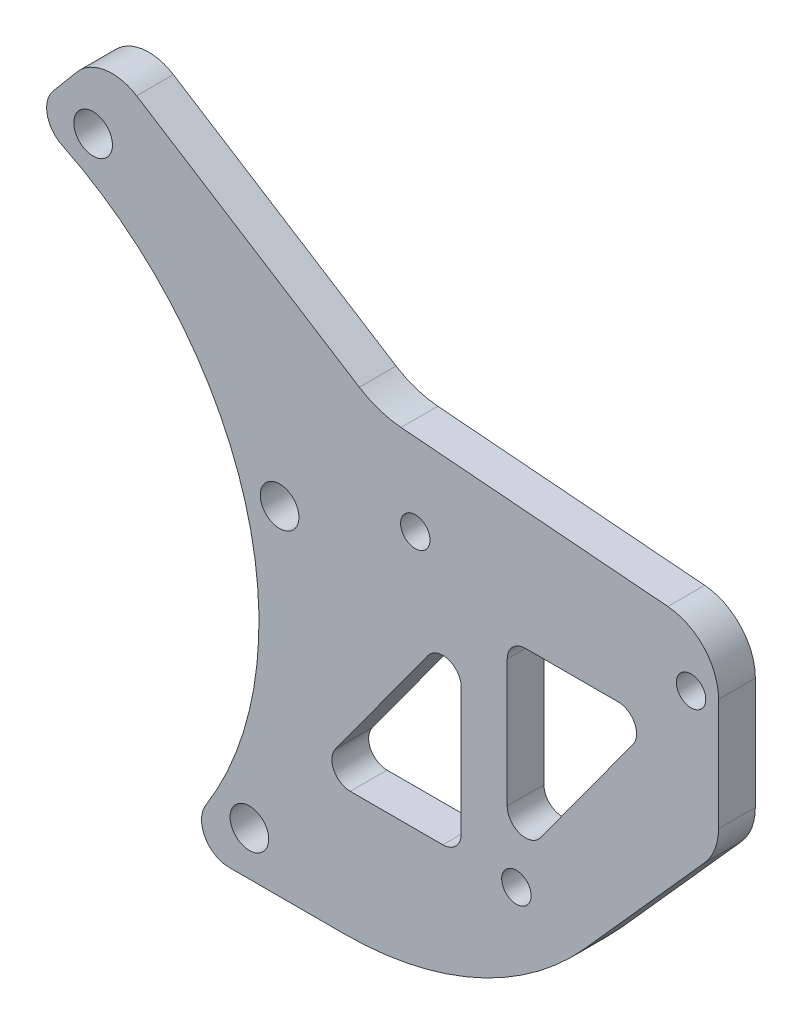
ISO-10303-21;
HEADER;
FILE_DESCRIPTION(('STEP AP214'),'2;1');
FILE_NAME('part.step','',(''),(''),'','','');
FILE_SCHEMA(('AUTOMOTIVE_DESIGN { 1 0 10303 214 1 1 1 1 }'));
ENDSEC;
DATA;
#1=APPLICATION_CONTEXT('core data for automotive mechanical design processes');
#2=APPLICATION_PROTOCOL_DEFINITION('international standard','automotive_design',2000,#1);
#3=PRODUCT_CONTEXT('',#1,'mechanical');
#4=PRODUCT('Part','Part','',(#3));
#5=PRODUCT_RELATED_PRODUCT_CATEGORY('part','',(#4));
#6=PRODUCT_DEFINITION_FORMATION('','',#4);
#7=PRODUCT_DEFINITION_CONTEXT('part definition',#1,'design');
#8=PRODUCT_DEFINITION('design','',#6,#7);
#9=PRODUCT_DEFINITION_SHAPE('','',#8);
#10=(LENGTH_UNIT() NAMED_UNIT(*) SI_UNIT(.MILLI.,.METRE.));
#11=(NAMED_UNIT(*) PLANE_ANGLE_UNIT() SI_UNIT($,.RADIAN.));
#12=(NAMED_UNIT(*) SI_UNIT($,.STERADIAN.) SOLID_ANGLE_UNIT());
#13=UNCERTAINTY_MEASURE_WITH_UNIT(LENGTH_MEASURE(1.E-05),#10,'distance_accuracy_value','');
#14=(GEOMETRIC_REPRESENTATION_CONTEXT(3) GLOBAL_UNCERTAINTY_ASSIGNED_CONTEXT((#13)) GLOBAL_UNIT_ASSIGNED_CONTEXT((#10,
#11,#12)) REPRESENTATION_CONTEXT('',''));
#15=CARTESIAN_POINT('',(0.,0.,0.));
#16=DIRECTION('',(0.,0.,1.));
#17=DIRECTION('',(1.,0.,0.));
#18=AXIS2_PLACEMENT_3D('',#15,#16,#17);
#19=CARTESIAN_POINT('',(0.,0.,4.));
#20=DIRECTION('',(0.,0.,-1.));
#21=DIRECTION('',(-1.,0.,0.));
#22=AXIS2_PLACEMENT_3D('',#19,#20,#21);
#23=CYLINDRICAL_SURFACE('',#22,38.);
#24=CARTESIAN_POINT('',(0.,0.,0.));
#25=DIRECTION('',(0.,0.,1.));
#26=DIRECTION('',(1.,0.,0.));
#27=AXIS2_PLACEMENT_3D('',#24,#25,#26);
#28=CIRCLE('',#27,38.);
#29=CARTESIAN_POINT('',(32.2078784178792,-20.1656283765003,0.));
#30=VERTEX_POINT('',#29);
#31=CARTESIAN_POINT('',(16.5911175233825,34.1867638030468,0.));
#32=VERTEX_POINT('',#31);
#33=EDGE_CURVE('E376',#30,#32,#28,.T.);
#34=ORIENTED_EDGE('',*,*,#33,.F.);
#35=DIRECTION('',(0.,0.,-1.));
#36=VECTOR('',#35,1.);
#37=CARTESIAN_POINT('',(32.2078784178792,-20.1656283765003,4.));
#38=LINE('',#37,#36);
#39=CARTESIAN_POINT('',(32.2078784178792,-20.1656283765003,4.));
#40=VERTEX_POINT('',#39);
#41=EDGE_CURVE('E354',#30,#40,#38,.F.);
#42=ORIENTED_EDGE('',*,*,#41,.T.);
#43=CARTESIAN_POINT('',(0.,0.,4.));
#44=DIRECTION('',(0.,0.,1.));
#45=DIRECTION('',(1.,0.,0.));
#46=AXIS2_PLACEMENT_3D('',#43,#44,#45);
#47=CIRCLE('',#46,38.);
#48=CARTESIAN_POINT('',(16.5911175233825,34.1867638030468,4.));
#49=VERTEX_POINT('',#48);
#50=EDGE_CURVE('E364',#40,#49,#47,.T.);
#51=ORIENTED_EDGE('',*,*,#50,.T.);
#52=DIRECTION('',(0.,0.,-1.));
#53=VECTOR('',#52,1.);
#54=CARTESIAN_POINT('',(16.5911175233825,34.1867638030468,4.));
#55=LINE('',#54,#53);
#56=EDGE_CURVE('E351',#49,#32,#55,.T.);
#57=ORIENTED_EDGE('',*,*,#56,.T.);
#58=EDGE_LOOP('',(#34,#42,#51,#57));
#59=FACE_BOUND('',#58,.T.);
#60=ADVANCED_FACE('F41',(#59),#23,.F.);
#61=CARTESIAN_POINT('',(0.,-24.7576516693819,4.));
#62=DIRECTION('',(0.,-1.,0.));
#63=DIRECTION('',(0.,0.,-1.));
#64=AXIS2_PLACEMENT_3D('',#61,#62,#63);
#65=PLANE('',#64);
#66=DIRECTION('',(-1.,0.,0.));
#67=VECTOR('',#66,1.);
#68=CARTESIAN_POINT('',(0.,-24.7576516693819,4.));
#69=LINE('',#68,#67);
#70=CARTESIAN_POINT('',(47.3259544985668,-24.7576516693819,4.));
#71=VERTEX_POINT('',#70);
#72=CARTESIAN_POINT('',(34.750605661396,-24.7576516693819,4.));
#73=VERTEX_POINT('',#72);
#74=EDGE_CURVE('E362',#71,#73,#69,.T.);
#75=ORIENTED_EDGE('',*,*,#74,.T.);
#76=DIRECTION('',(0.,0.,-1.));
#77=VECTOR('',#76,1.);
#78=CARTESIAN_POINT('',(34.750605661396,-24.7576516693819,4.));
#79=LINE('',#78,#77);
#80=CARTESIAN_POINT('',(34.750605661396,-24.7576516693819,0.));
#81=VERTEX_POINT('',#80);
#82=EDGE_CURVE('E345',#73,#81,#79,.T.);
#83=ORIENTED_EDGE('',*,*,#82,.T.);
#84=DIRECTION('',(-1.,0.,0.));
#85=VECTOR('',#84,1.);
#86=CARTESIAN_POINT('',(0.,-24.7576516693819,0.));
#87=LINE('',#86,#85);
#88=CARTESIAN_POINT('',(47.3259544985668,-24.7576516693819,0.));
#89=VERTEX_POINT('',#88);
#90=EDGE_CURVE('E377',#89,#81,#87,.T.);
#91=ORIENTED_EDGE('',*,*,#90,.F.);
#92=DIRECTION('',(0.,0.,-1.));
#93=VECTOR('',#92,1.);
#94=CARTESIAN_POINT('',(47.3259544985668,-24.7576516693819,4.));
#95=LINE('',#94,#93);
#96=EDGE_CURVE('E283',#89,#71,#95,.F.);
#97=ORIENTED_EDGE('',*,*,#96,.T.);
#98=EDGE_LOOP('',(#75,#83,#91,#97));
#99=FACE_BOUND('',#98,.T.);
#100=ADVANCED_FACE('F369',(#99),#65,.T.);
#101=CARTESIAN_POINT('',(47.3526048818493,-42.2791115016511,4.));
#102=DIRECTION('',(0.745937661625915,-0.666015769308852,0.));
#103=DIRECTION('',(0.666015769308852,0.745937661625915,0.));
#104=AXIS2_PLACEMENT_3D('',#101,#102,#103);
#105=PLANE('',#104);
#106=DIRECTION('',(-0.666015769308852,-0.745937661625915,0.));
#107=VECTOR('',#106,1.);
#108=CARTESIAN_POINT('',(47.3526048818493,-42.2791115016511,4.));
#109=LINE('',#108,#107);
#110=CARTESIAN_POINT('',(86.4723914161309,1.53504941674431,4.));
#111=VERTEX_POINT('',#110);
#112=CARTESIAN_POINT('',(73.4337726554738,-13.0682035951917,4.));
#113=VERTEX_POINT('',#112);
#114=EDGE_CURVE('E372',#111,#113,#109,.T.);
#115=ORIENTED_EDGE('',*,*,#114,.T.);
#116=DIRECTION('',(0.,0.,-1.));
#117=VECTOR('',#116,1.);
#118=CARTESIAN_POINT('',(73.4337726554738,-13.0682035951917,4.));
#119=LINE('',#118,#117);
#120=CARTESIAN_POINT('',(73.4337726554738,-13.0682035951917,0.));
#121=VERTEX_POINT('',#120);
#122=EDGE_CURVE('E278',#113,#121,#119,.T.);
#123=ORIENTED_EDGE('',*,*,#122,.T.);
#124=DIRECTION('',(-0.666015769308852,-0.745937661625915,0.));
#125=VECTOR('',#124,1.);
#126=CARTESIAN_POINT('',(47.3526048818493,-42.2791115016511,0.));
#127=LINE('',#126,#125);
#128=CARTESIAN_POINT('',(86.4723914161309,1.53504941674431,0.));
#129=VERTEX_POINT('',#128);
#130=EDGE_CURVE('E382',#129,#121,#127,.T.);
#131=ORIENTED_EDGE('',*,*,#130,.F.);
#132=DIRECTION('',(0.,0.,-1.));
#133=VECTOR('',#132,1.);
#134=CARTESIAN_POINT('',(86.4723914161309,1.53504941674431,4.));
#135=LINE('',#134,#133);
#136=EDGE_CURVE('E259',#129,#111,#135,.F.);
#137=ORIENTED_EDGE('',*,*,#136,.T.);
#138=EDGE_LOOP('',(#115,#123,#131,#137));
#139=FACE_BOUND('',#138,.T.);
#140=ADVANCED_FACE('F452',(#139),#105,.T.);
#141=CARTESIAN_POINT('',(87.9967654463754,0.,4.));
#142=DIRECTION('',(1.,0.,0.));
#143=DIRECTION('',(0.,0.,-1.));
#144=AXIS2_PLACEMENT_3D('',#141,#142,#143);
#145=PLANE('',#144);
#146=DIRECTION('',(0.,-1.,0.));
#147=VECTOR('',#146,1.);
#148=CARTESIAN_POINT('',(87.9967654463754,0.,4.));
#149=LINE('',#148,#147);
#150=CARTESIAN_POINT('',(87.9967654463754,17.7091447003682,4.));
#151=VERTEX_POINT('',#150);
#152=CARTESIAN_POINT('',(87.9967654463754,5.53114403259741,4.));
#153=VERTEX_POINT('',#152);
#154=EDGE_CURVE('E410',#151,#153,#149,.T.);
#155=ORIENTED_EDGE('',*,*,#154,.T.);
#156=DIRECTION('',(0.,0.,-1.));
#157=VECTOR('',#156,1.);
#158=CARTESIAN_POINT('',(87.9967654463754,5.53114403259741,4.));
#159=LINE('',#158,#157);
#160=CARTESIAN_POINT('',(87.9967654463754,5.53114403259741,0.));
#161=VERTEX_POINT('',#160);
#162=EDGE_CURVE('E252',#153,#161,#159,.T.);
#163=ORIENTED_EDGE('',*,*,#162,.T.);
#164=DIRECTION('',(0.,-1.,0.));
#165=VECTOR('',#164,1.);
#166=CARTESIAN_POINT('',(87.9967654463754,0.,0.));
#167=LINE('',#166,#165);
#168=CARTESIAN_POINT('',(87.9967654463754,17.7091447003682,0.));
#169=VERTEX_POINT('',#168);
#170=EDGE_CURVE('E391',#169,#161,#167,.T.);
#171=ORIENTED_EDGE('',*,*,#170,.F.);
#172=DIRECTION('',(0.,0.,-1.));
#173=VECTOR('',#172,1.);
#174=CARTESIAN_POINT('',(87.9967654463754,17.7091447003682,4.));
#175=LINE('',#174,#173);
#176=EDGE_CURVE('E250',#169,#151,#175,.F.);
#177=ORIENTED_EDGE('',*,*,#176,.T.);
#178=EDGE_LOOP('',(#155,#163,#171,#177));
#179=FACE_BOUND('',#178,.T.);
#180=ADVANCED_FACE('F672',(#179),#145,.T.);
#181=CARTESIAN_POINT('',(2.44693146133236,30.1788213564325,4.));
#182=DIRECTION('',(0.0808158687660548,0.996729048114676,0.));
#183=DIRECTION('',(-0.996729048114676,0.0808158687660548,0.));
#184=AXIS2_PLACEMENT_3D('',#181,#182,#183);
#185=PLANE('',#184);
#186=DIRECTION('',(0.996729048114676,-0.0808158687660548,0.));
#187=VECTOR('',#186,1.);
#188=CARTESIAN_POINT('',(2.44693146133236,30.1788213564325,0.));
#189=LINE('',#188,#187);
#190=CARTESIAN_POINT('',(53.4552970579246,26.0430079296817,0.));
#191=VERTEX_POINT('',#190);
#192=CARTESIAN_POINT('',(82.4816606589718,23.6895189890563,0.));
#193=VERTEX_POINT('',#192);
#194=EDGE_CURVE('E394',#191,#193,#189,.T.);
#195=ORIENTED_EDGE('',*,*,#194,.F.);
#196=DIRECTION('',(0.,0.,-1.));
#197=VECTOR('',#196,1.);
#198=CARTESIAN_POINT('',(53.4552970579246,26.0430079296817,4.));
#199=LINE('',#198,#197);
#200=CARTESIAN_POINT('',(53.4552970579246,26.0430079296817,4.));
#201=VERTEX_POINT('',#200);
#202=EDGE_CURVE('E272',#191,#201,#199,.F.);
#203=ORIENTED_EDGE('',*,*,#202,.T.);
#204=DIRECTION('',(0.996729048114676,-0.0808158687660548,0.));
#205=VECTOR('',#204,1.);
#206=CARTESIAN_POINT('',(2.44693146133236,30.1788213564325,4.));
#207=LINE('',#206,#205);
#208=CARTESIAN_POINT('',(82.4816606589718,23.6895189890563,4.));
#209=VERTEX_POINT('',#208);
#210=EDGE_CURVE('E413',#201,#209,#207,.T.);
#211=ORIENTED_EDGE('',*,*,#210,.T.);
#212=DIRECTION('',(0.,0.,-1.));
#213=VECTOR('',#212,1.);
#214=CARTESIAN_POINT('',(82.4816606589718,23.6895189890563,4.));
#215=LINE('',#214,#213);
#216=EDGE_CURVE('E266',#209,#193,#215,.T.);
#217=ORIENTED_EDGE('',*,*,#216,.T.);
#218=EDGE_LOOP('',(#195,#203,#211,#217));
#219=FACE_BOUND('',#218,.T.);
#220=ADVANCED_FACE('F664',(#219),#185,.T.);
#221=CARTESIAN_POINT('',(26.4615153644678,41.7813400491597,4.));
#222=DIRECTION('',(0.535052081184345,0.844819075554229,0.));
#223=DIRECTION('',(-0.844819075554229,0.535052081184345,0.));
#224=AXIS2_PLACEMENT_3D('',#221,#222,#223);
#225=PLANE('',#224);
#226=DIRECTION('',(0.844819075554229,-0.535052081184345,0.));
#227=VECTOR('',#226,1.);
#228=CARTESIAN_POINT('',(26.4615153644678,41.7813400491597,4.));
#229=LINE('',#228,#227);
#230=CARTESIAN_POINT('',(24.691260684177,42.9025013466772,4.));
#231=VERTEX_POINT('',#230);
#232=CARTESIAN_POINT('',(48.9129349337417,27.5621076552862,4.));
#233=VERTEX_POINT('',#232);
#234=EDGE_CURVE('E415',#231,#233,#229,.T.);
#235=ORIENTED_EDGE('',*,*,#234,.T.);
#236=DIRECTION('',(0.,0.,-1.));
#237=VECTOR('',#236,1.);
#238=CARTESIAN_POINT('',(48.9129349337417,27.5621076552862,0.));
#239=LINE('',#238,#237);
#240=CARTESIAN_POINT('',(48.9129349337417,27.5621076552862,0.));
#241=VERTEX_POINT('',#240);
#242=EDGE_CURVE('E269',#233,#241,#239,.T.);
#243=ORIENTED_EDGE('',*,*,#242,.T.);
#244=DIRECTION('',(0.844819075554229,-0.535052081184345,0.));
#245=VECTOR('',#244,1.);
#246=CARTESIAN_POINT('',(26.4615153644678,41.7813400491597,0.));
#247=LINE('',#246,#245);
#248=CARTESIAN_POINT('',(24.691260684177,42.9025013466772,0.));
#249=VERTEX_POINT('',#248);
#250=EDGE_CURVE('E225',#249,#241,#247,.T.);
#251=ORIENTED_EDGE('',*,*,#250,.F.);
#252=DIRECTION('',(0.,0.,-1.));
#253=VECTOR('',#252,1.);
#254=CARTESIAN_POINT('',(24.691260684177,42.9025013466772,4.));
#255=LINE('',#254,#253);
#256=EDGE_CURVE('E233',#249,#231,#255,.F.);
#257=ORIENTED_EDGE('',*,*,#256,.T.);
#258=EDGE_LOOP('',(#235,#243,#251,#257));
#259=FACE_BOUND('',#258,.T.);
#260=ADVANCED_FACE('F658',(#259),#225,.T.);
#261=CARTESIAN_POINT('',(40.243259995168,12.019984399379,4.));
#262=DIRECTION('',(0.,0.,-1.));
#263=DIRECTION('',(-1.,0.,0.));
#264=AXIS2_PLACEMENT_3D('',#261,#262,#263);
#265=CYLINDRICAL_SURFACE('',#264,2.1);
#266=CARTESIAN_POINT('',(40.243259995168,12.019984399379,4.));
#267=DIRECTION('',(0.,0.,1.));
#268=DIRECTION('',(1.,0.,0.));
#269=AXIS2_PLACEMENT_3D('',#266,#267,#268);
#270=CIRCLE('',#269,2.1);
#271=CARTESIAN_POINT('',(42.343259995168,12.019984399379,4.));
#272=VERTEX_POINT('',#271);
#273=EDGE_CURVE('E241',#272,#272,#270,.T.);
#274=ORIENTED_EDGE('',*,*,#273,.T.);
#275=EDGE_LOOP('',(#274));
#276=FACE_BOUND('',#275,.T.);
#277=CARTESIAN_POINT('',(40.243259995168,12.019984399379,0.));
#278=DIRECTION('',(0.,0.,1.));
#279=DIRECTION('',(1.,0.,0.));
#280=AXIS2_PLACEMENT_3D('',#277,#278,#279);
#281=CIRCLE('',#280,2.1);
#282=CARTESIAN_POINT('',(42.343259995168,12.019984399379,0.));
#283=VERTEX_POINT('',#282);
#284=EDGE_CURVE('E398',#283,#283,#281,.T.);
#285=ORIENTED_EDGE('',*,*,#284,.F.);
#286=EDGE_LOOP('',(#285));
#287=FACE_BOUND('',#286,.T.);
#288=ADVANCED_FACE('F424',(#276,#287),#265,.F.);
#289=CARTESIAN_POINT('',(36.9556945181939,-19.9568695610792,4.));
#290=DIRECTION('',(0.,0.,-1.));
#291=DIRECTION('',(-1.,0.,0.));
#292=AXIS2_PLACEMENT_3D('',#289,#290,#291);
#293=CYLINDRICAL_SURFACE('',#292,2.09999999999999);
#294=CARTESIAN_POINT('',(36.9556945181939,-19.9568695610792,4.));
#295=DIRECTION('',(0.,0.,1.));
#296=DIRECTION('',(1.,0.,0.));
#297=AXIS2_PLACEMENT_3D('',#294,#295,#296);
#298=CIRCLE('',#297,2.09999999999999);
#299=CARTESIAN_POINT('',(39.0556945181939,-19.9568695610792,4.));
#300=VERTEX_POINT('',#299);
#301=EDGE_CURVE('E419',#300,#300,#298,.T.);
#302=ORIENTED_EDGE('',*,*,#301,.T.);
#303=EDGE_LOOP('',(#302));
#304=FACE_BOUND('',#303,.T.);
#305=CARTESIAN_POINT('',(36.9556945181939,-19.9568695610792,0.));
#306=DIRECTION('',(0.,0.,1.));
#307=DIRECTION('',(1.,0.,0.));
#308=AXIS2_PLACEMENT_3D('',#305,#306,#307);
#309=CIRCLE('',#308,2.09999999999999);
#310=CARTESIAN_POINT('',(39.0556945181939,-19.9568695610792,0.));
#311=VERTEX_POINT('',#310);
#312=EDGE_CURVE('E224',#311,#311,#309,.T.);
#313=ORIENTED_EDGE('',*,*,#312,.F.);
#314=EDGE_LOOP('',(#313));
#315=FACE_BOUND('',#314,.T.);
#316=ADVANCED_FACE('F442',(#304,#315),#293,.F.);
#317=CARTESIAN_POINT('',(-9.95609994871663,8.35415979493229,4.));
#318=DIRECTION('',(-0.766044443118977,0.64278760968654,0.));
#319=DIRECTION('',(-0.64278760968654,-0.766044443118977,0.));
#320=AXIS2_PLACEMENT_3D('',#317,#318,#319);
#321=PLANE('',#320);
#322=DIRECTION('',(0.642787609686541,0.766044443118977,0.));
#323=VECTOR('',#322,1.);
#324=CARTESIAN_POINT('',(-9.95609994871663,8.35415979493229,0.));
#325=LINE('',#324,#323);
#326=CARTESIAN_POINT('',(15.6028092616611,38.8140816691891,0.));
#327=VERTEX_POINT('',#326);
#328=CARTESIAN_POINT('',(18.1857780626604,41.8923440173388,0.));
#329=VERTEX_POINT('',#328);
#330=EDGE_CURVE('E213',#327,#329,#325,.T.);
#331=ORIENTED_EDGE('',*,*,#330,.F.);
#332=DIRECTION('',(0.,0.,-1.));
#333=VECTOR('',#332,1.);
#334=CARTESIAN_POINT('',(15.6028092616611,38.8140816691891,4.));
#335=LINE('',#334,#333);
#336=CARTESIAN_POINT('',(15.6028092616611,38.8140816691891,4.));
#337=VERTEX_POINT('',#336);
#338=EDGE_CURVE('E11',#327,#337,#335,.F.);
#339=ORIENTED_EDGE('',*,*,#338,.T.);
#340=DIRECTION('',(0.642787609686541,0.766044443118977,0.));
#341=VECTOR('',#340,1.);
#342=CARTESIAN_POINT('',(-9.95609994871663,8.35415979493229,4.));
#343=LINE('',#342,#341);
#344=CARTESIAN_POINT('',(18.1857780626604,41.8923440173388,4.));
#345=VERTEX_POINT('',#344);
#346=EDGE_CURVE('E236',#337,#345,#343,.T.);
#347=ORIENTED_EDGE('',*,*,#346,.T.);
#348=DIRECTION('',(0.,0.,-1.));
#349=VECTOR('',#348,1.);
#350=CARTESIAN_POINT('',(18.1857780626604,41.8923440173387,4.));
#351=LINE('',#350,#349);
#352=EDGE_CURVE('E232',#345,#329,#351,.T.);
#353=ORIENTED_EDGE('',*,*,#352,.T.);
#354=EDGE_LOOP('',(#331,#339,#347,#353));
#355=FACE_BOUND('',#354,.T.);
#356=ADVANCED_FACE('F235',(#355),#321,.T.);
#357=CARTESIAN_POINT('',(19.9568695610791,36.955694518194,4.));
#358=DIRECTION('',(0.,0.,-1.));
#359=DIRECTION('',(-1.,0.,0.));
#360=AXIS2_PLACEMENT_3D('',#357,#358,#359);
#361=CYLINDRICAL_SURFACE('',#360,2.1);
#362=CARTESIAN_POINT('',(19.9568695610791,36.955694518194,4.));
#363=DIRECTION('',(0.,0.,1.));
#364=DIRECTION('',(1.,0.,0.));
#365=AXIS2_PLACEMENT_3D('',#362,#363,#364);
#366=CIRCLE('',#365,2.1);
#367=CARTESIAN_POINT('',(22.0568695610791,36.955694518194,4.));
#368=VERTEX_POINT('',#367);
#369=EDGE_CURVE('E238',#368,#368,#366,.T.);
#370=ORIENTED_EDGE('',*,*,#369,.T.);
#371=EDGE_LOOP('',(#370));
#372=FACE_BOUND('',#371,.T.);
#373=CARTESIAN_POINT('',(19.9568695610791,36.955694518194,0.));
#374=DIRECTION('',(0.,0.,1.));
#375=DIRECTION('',(1.,0.,0.));
#376=AXIS2_PLACEMENT_3D('',#373,#374,#375);
#377=CIRCLE('',#376,2.1);
#378=CARTESIAN_POINT('',(22.0568695610791,36.955694518194,0.));
#379=VERTEX_POINT('',#378);
#380=EDGE_CURVE('E244',#379,#379,#377,.T.);
#381=ORIENTED_EDGE('',*,*,#380,.F.);
#382=EDGE_LOOP('',(#381));
#383=FACE_BOUND('',#382,.T.);
#384=ADVANCED_FACE('F429',(#372,#383),#361,.F.);
#385=CARTESIAN_POINT('',(0.,0.,4.));
#386=DIRECTION('',(0.,0.,1.));
#387=DIRECTION('',(1.,0.,0.));
#388=AXIS2_PLACEMENT_3D('',#385,#386,#387);
#389=PLANE('',#388);
#390=CARTESIAN_POINT('',(66.003259995168,-11.000015600621,4.));
#391=DIRECTION('',(0.,0.,1.));
#392=DIRECTION('',(1.,0.,0.));
#393=AXIS2_PLACEMENT_3D('',#390,#391,#392);
#394=CIRCLE('',#393,1.6);
#395=CARTESIAN_POINT('',(67.603259995168,-11.000015600621,4.));
#396=VERTEX_POINT('',#395);
#397=EDGE_CURVE('E600',#396,#396,#394,.T.);
#398=ORIENTED_EDGE('',*,*,#397,.F.);
#399=EDGE_LOOP('',(#398));
#400=FACE_BOUND('',#399,.T.);
#401=DIRECTION('',(0.,-1.,0.));
#402=VECTOR('',#401,1.);
#403=CARTESIAN_POINT('',(65.003259995168,-10.000015600621,4.));
#404=LINE('',#403,#402);
#405=CARTESIAN_POINT('',(65.003259995168,9.99998439937898,4.));
#406=VERTEX_POINT('',#405);
#407=CARTESIAN_POINT('',(65.003259995168,-3.84964797343716,4.));
#408=VERTEX_POINT('',#407);
#409=EDGE_CURVE('E594',#406,#408,#404,.T.);
#410=ORIENTED_EDGE('',*,*,#409,.F.);
#411=CARTESIAN_POINT('',(67.003259995168,9.99998439937898,4.));
#412=DIRECTION('',(0.,0.,1.));
#413=DIRECTION('',(1.,0.,0.));
#414=AXIS2_PLACEMENT_3D('',#411,#412,#413);
#415=CIRCLE('',#414,2.);
#416=CARTESIAN_POINT('',(67.003259995168,11.999984399379,4.));
#417=VERTEX_POINT('',#416);
#418=EDGE_CURVE('E303',#406,#417,#415,.F.);
#419=ORIENTED_EDGE('',*,*,#418,.T.);
#420=DIRECTION('',(-1.,0.,0.));
#421=VECTOR('',#420,1.);
#422=CARTESIAN_POINT('',(65.003259995168,11.999984399379,4.));
#423=LINE('',#422,#421);
#424=CARTESIAN_POINT('',(77.0757199026706,11.999984399379,4.));
#425=VERTEX_POINT('',#424);
#426=EDGE_CURVE('E589',#425,#417,#423,.T.);
#427=ORIENTED_EDGE('',*,*,#426,.F.);
#428=CARTESIAN_POINT('',(77.0757199026706,9.99998439937898,4.));
#429=DIRECTION('',(0.,0.,1.));
#430=DIRECTION('',(1.,0.,0.));
#431=AXIS2_PLACEMENT_3D('',#428,#429,#430);
#432=CIRCLE('',#431,2.);
#433=CARTESIAN_POINT('',(78.693192071277,8.82364100402889,4.));
#434=VERTEX_POINT('',#433);
#435=EDGE_CURVE('E337',#425,#434,#432,.F.);
#436=ORIENTED_EDGE('',*,*,#435,.T.);
#437=DIRECTION('',(0.588171697675046,0.808736084303188,0.));
#438=VECTOR('',#437,1.);
#439=CARTESIAN_POINT('',(81.003259995168,11.999984399379,4.));
#440=LINE('',#439,#438);
#441=CARTESIAN_POINT('',(68.6207321637743,-5.02599136878725,4.));
#442=VERTEX_POINT('',#441);
#443=EDGE_CURVE('E591',#442,#434,#440,.T.);
#444=ORIENTED_EDGE('',*,*,#443,.F.);
#445=CARTESIAN_POINT('',(67.003259995168,-3.84964797343716,4.));
#446=DIRECTION('',(0.,0.,1.));
#447=DIRECTION('',(1.,0.,0.));
#448=AXIS2_PLACEMENT_3D('',#445,#446,#447);
#449=CIRCLE('',#448,2.);
#450=EDGE_CURVE('E329',#442,#408,#449,.F.);
#451=ORIENTED_EDGE('',*,*,#450,.T.);
#452=EDGE_LOOP('',(#410,#419,#427,#436,#444,#451));
#453=FACE_BOUND('',#452,.T.);
#454=DIRECTION('',(-0.588171697675046,-0.808736084303189,0.));
#455=VECTOR('',#454,1.);
#456=CARTESIAN_POINT('',(44.003259995168,-11.000015600621,4.));
#457=LINE('',#456,#455);
#458=CARTESIAN_POINT('',(56.3857878265616,6.02596016754521,4.));
#459=VERTEX_POINT('',#458);
#460=CARTESIAN_POINT('',(46.3133279190589,-7.82367220527093,4.));
#461=VERTEX_POINT('',#460);
#462=EDGE_CURVE('E580',#459,#461,#457,.T.);
#463=ORIENTED_EDGE('',*,*,#462,.F.);
#464=CARTESIAN_POINT('',(58.003259995168,4.84961677219512,4.));
#465=DIRECTION('',(0.,0.,1.));
#466=DIRECTION('',(1.,0.,0.));
#467=AXIS2_PLACEMENT_3D('',#464,#465,#466);
#468=CIRCLE('',#467,2.);
#469=CARTESIAN_POINT('',(60.003259995168,4.84961677219512,4.));
#470=VERTEX_POINT('',#469);
#471=EDGE_CURVE('E333',#459,#470,#468,.F.);
#472=ORIENTED_EDGE('',*,*,#471,.T.);
#473=DIRECTION('',(0.,1.,0.));
#474=VECTOR('',#473,1.);
#475=CARTESIAN_POINT('',(60.003259995168,10.999984399379,4.));
#476=LINE('',#475,#474);
#477=CARTESIAN_POINT('',(60.003259995168,-9.00001560062102,4.));
#478=VERTEX_POINT('',#477);
#479=EDGE_CURVE('E575',#478,#470,#476,.T.);
#480=ORIENTED_EDGE('',*,*,#479,.F.);
#481=CARTESIAN_POINT('',(58.003259995168,-9.00001560062102,4.));
#482=DIRECTION('',(0.,0.,1.));
#483=DIRECTION('',(1.,0.,0.));
#484=AXIS2_PLACEMENT_3D('',#481,#482,#483);
#485=CIRCLE('',#484,2.);
#486=CARTESIAN_POINT('',(58.003259995168,-11.000015600621,4.));
#487=VERTEX_POINT('',#486);
#488=EDGE_CURVE('E297',#478,#487,#485,.F.);
#489=ORIENTED_EDGE('',*,*,#488,.T.);
#490=DIRECTION('',(1.,0.,0.));
#491=VECTOR('',#490,1.);
#492=CARTESIAN_POINT('',(60.003259995168,-11.000015600621,4.));
#493=LINE('',#492,#491);
#494=CARTESIAN_POINT('',(47.9308000876653,-11.000015600621,4.));
#495=VERTEX_POINT('',#494);
#496=EDGE_CURVE('E578',#495,#487,#493,.T.);
#497=ORIENTED_EDGE('',*,*,#496,.F.);
#498=CARTESIAN_POINT('',(47.9308000876653,-9.00001560062102,4.));
#499=DIRECTION('',(0.,0.,1.));
#500=DIRECTION('',(1.,0.,0.));
#501=AXIS2_PLACEMENT_3D('',#498,#499,#500);
#502=CIRCLE('',#501,2.);
#503=EDGE_CURVE('E341',#495,#461,#502,.F.);
#504=ORIENTED_EDGE('',*,*,#503,.T.);
#505=EDGE_LOOP('',(#463,#472,#480,#489,#497,#504));
#506=FACE_BOUND('',#505,.T.);
#507=CARTESIAN_POINT('',(85.003259995168,16.999984399379,4.));
#508=DIRECTION('',(0.,0.,1.));
#509=DIRECTION('',(1.,0.,0.));
#510=AXIS2_PLACEMENT_3D('',#507,#508,#509);
#511=CIRCLE('',#510,1.6);
#512=CARTESIAN_POINT('',(86.603259995168,16.999984399379,4.));
#513=VERTEX_POINT('',#512);
#514=EDGE_CURVE('E565',#513,#513,#511,.T.);
#515=ORIENTED_EDGE('',*,*,#514,.F.);
#516=EDGE_LOOP('',(#515));
#517=FACE_BOUND('',#516,.T.);
#518=CARTESIAN_POINT('',(55.003259995168,16.999984399379,4.));
#519=DIRECTION('',(0.,0.,1.));
#520=DIRECTION('',(1.,0.,0.));
#521=AXIS2_PLACEMENT_3D('',#518,#519,#520);
#522=CIRCLE('',#521,1.6);
#523=CARTESIAN_POINT('',(56.603259995168,16.999984399379,4.));
#524=VERTEX_POINT('',#523);
#525=EDGE_CURVE('E385',#524,#524,#522,.T.);
#526=ORIENTED_EDGE('',*,*,#525,.F.);
#527=EDGE_LOOP('',(#526));
#528=FACE_BOUND('',#527,.T.);
#529=ORIENTED_EDGE('',*,*,#50,.F.);
#530=CARTESIAN_POINT('',(34.750605661396,-21.7576516693819,4.));
#531=DIRECTION('',(0.,0.,1.));
#532=DIRECTION('',(1.,0.,0.));
#533=AXIS2_PLACEMENT_3D('',#530,#531,#532);
#534=CIRCLE('',#533,3.);
#535=EDGE_CURVE('E50',#40,#73,#534,.T.);
#536=ORIENTED_EDGE('',*,*,#535,.T.);
#537=ORIENTED_EDGE('',*,*,#74,.F.);
#538=CARTESIAN_POINT('',(47.3259544985668,10.2423483306181,4.));
#539=DIRECTION('',(0.,0.,1.));
#540=DIRECTION('',(1.,0.,0.));
#541=AXIS2_PLACEMENT_3D('',#538,#539,#540);
#542=CIRCLE('',#541,35.);
#543=EDGE_CURVE('E285',#71,#113,#542,.T.);
#544=ORIENTED_EDGE('',*,*,#543,.T.);
#545=ORIENTED_EDGE('',*,*,#114,.F.);
#546=CARTESIAN_POINT('',(81.9967654463754,5.53114403259741,4.));
#547=DIRECTION('',(0.,0.,1.));
#548=DIRECTION('',(1.,0.,0.));
#549=AXIS2_PLACEMENT_3D('',#546,#547,#548);
#550=CIRCLE('',#549,6.);
#551=EDGE_CURVE('E264',#111,#153,#550,.T.);
#552=ORIENTED_EDGE('',*,*,#551,.T.);
#553=ORIENTED_EDGE('',*,*,#154,.F.);
#554=CARTESIAN_POINT('',(81.9967654463754,17.7091447003682,4.));
#555=DIRECTION('',(0.,0.,1.));
#556=DIRECTION('',(1.,0.,0.));
#557=AXIS2_PLACEMENT_3D('',#554,#555,#556);
#558=CIRCLE('',#557,6.);
#559=EDGE_CURVE('E261',#151,#209,#558,.T.);
#560=ORIENTED_EDGE('',*,*,#559,.T.);
#561=ORIENTED_EDGE('',*,*,#210,.F.);
#562=CARTESIAN_POINT('',(54.2634557455851,36.0102984108285,4.));
#563=DIRECTION('',(0.,0.,1.));
#564=DIRECTION('',(1.,0.,0.));
#565=AXIS2_PLACEMENT_3D('',#562,#563,#564);
#566=CIRCLE('',#565,10.);
#567=EDGE_CURVE('E276',#201,#233,#566,.F.);
#568=ORIENTED_EDGE('',*,*,#567,.T.);
#569=ORIENTED_EDGE('',*,*,#234,.F.);
#570=CARTESIAN_POINT('',(22.0160002782553,38.678405968906,4.));
#571=DIRECTION('',(0.,0.,1.));
#572=DIRECTION('',(1.,0.,0.));
#573=AXIS2_PLACEMENT_3D('',#570,#571,#572);
#574=CIRCLE('',#573,5.);
#575=EDGE_CURVE('E248',#231,#345,#574,.T.);
#576=ORIENTED_EDGE('',*,*,#575,.T.);
#577=ORIENTED_EDGE('',*,*,#346,.F.);
#578=CARTESIAN_POINT('',(17.900942591018,36.8857188401294,4.));
#579=DIRECTION('',(0.,0.,1.));
#580=DIRECTION('',(1.,0.,0.));
#581=AXIS2_PLACEMENT_3D('',#578,#579,#580);
#582=CIRCLE('',#581,3.);
#583=EDGE_CURVE('E62',#337,#49,#582,.T.);
#584=ORIENTED_EDGE('',*,*,#583,.T.);
#585=EDGE_LOOP('',(#529,#536,#537,#544,#545,#552,#553,#560,#561,#568,#569,#576,#577,#584));
#586=FACE_BOUND('',#585,.T.);
#587=ORIENTED_EDGE('',*,*,#301,.F.);
#588=EDGE_LOOP('',(#587));
#589=FACE_BOUND('',#588,.T.);
#590=ORIENTED_EDGE('',*,*,#273,.F.);
#591=EDGE_LOOP('',(#590));
#592=FACE_BOUND('',#591,.T.);
#593=ORIENTED_EDGE('',*,*,#369,.F.);
#594=EDGE_LOOP('',(#593));
#595=FACE_BOUND('',#594,.T.);
#596=ADVANCED_FACE('F360',(#400,#453,#506,#517,#528,#586,#589,#592,#595),#389,.T.);
#597=CARTESIAN_POINT('',(0.,0.,0.));
#598=DIRECTION('',(0.,0.,1.));
#599=DIRECTION('',(1.,0.,0.));
#600=AXIS2_PLACEMENT_3D('',#597,#598,#599);
#601=PLANE('',#600);
#602=CARTESIAN_POINT('',(66.003259995168,-11.000015600621,0.));
#603=DIRECTION('',(0.,0.,1.));
#604=DIRECTION('',(1.,0.,0.));
#605=AXIS2_PLACEMENT_3D('',#602,#603,#604);
#606=CIRCLE('',#605,1.6);
#607=CARTESIAN_POINT('',(67.603259995168,-11.000015600621,0.));
#608=VERTEX_POINT('',#607);
#609=EDGE_CURVE('E45',#608,#608,#606,.T.);
#610=ORIENTED_EDGE('',*,*,#609,.T.);
#611=EDGE_LOOP('',(#610));
#612=FACE_BOUND('',#611,.T.);
#613=DIRECTION('',(1.,0.,0.));
#614=VECTOR('',#613,1.);
#615=CARTESIAN_POINT('',(65.003259995168,11.999984399379,0.));
#616=LINE('',#615,#614);
#617=CARTESIAN_POINT('',(67.003259995168,11.999984399379,0.));
#618=VERTEX_POINT('',#617);
#619=CARTESIAN_POINT('',(77.0757199026706,11.999984399379,0.));
#620=VERTEX_POINT('',#619);
#621=EDGE_CURVE('E552',#618,#620,#616,.T.);
#622=ORIENTED_EDGE('',*,*,#621,.F.);
#623=CARTESIAN_POINT('',(67.003259995168,9.99998439937898,0.));
#624=DIRECTION('',(0.,0.,1.));
#625=DIRECTION('',(1.,0.,0.));
#626=AXIS2_PLACEMENT_3D('',#623,#624,#625);
#627=CIRCLE('',#626,2.);
#628=CARTESIAN_POINT('',(65.003259995168,9.99998439937898,0.));
#629=VERTEX_POINT('',#628);
#630=EDGE_CURVE('E306',#618,#629,#627,.T.);
#631=ORIENTED_EDGE('',*,*,#630,.T.);
#632=DIRECTION('',(0.,1.,0.));
#633=VECTOR('',#632,1.);
#634=CARTESIAN_POINT('',(65.003259995168,-10.000015600621,0.));
#635=LINE('',#634,#633);
#636=CARTESIAN_POINT('',(65.003259995168,-3.84964797343716,0.));
#637=VERTEX_POINT('',#636);
#638=EDGE_CURVE('E597',#637,#629,#635,.T.);
#639=ORIENTED_EDGE('',*,*,#638,.F.);
#640=CARTESIAN_POINT('',(67.003259995168,-3.84964797343716,0.));
#641=DIRECTION('',(0.,0.,1.));
#642=DIRECTION('',(1.,0.,0.));
#643=AXIS2_PLACEMENT_3D('',#640,#641,#642);
#644=CIRCLE('',#643,2.);
#645=CARTESIAN_POINT('',(68.6207321637743,-5.02599136878725,0.));
#646=VERTEX_POINT('',#645);
#647=EDGE_CURVE('E331',#637,#646,#644,.T.);
#648=ORIENTED_EDGE('',*,*,#647,.T.);
#649=DIRECTION('',(-0.588171697675046,-0.808736084303189,0.));
#650=VECTOR('',#649,1.);
#651=CARTESIAN_POINT('',(81.003259995168,11.999984399379,0.));
#652=LINE('',#651,#650);
#653=CARTESIAN_POINT('',(78.693192071277,8.82364100402889,0.));
#654=VERTEX_POINT('',#653);
#655=EDGE_CURVE('E569',#654,#646,#652,.T.);
#656=ORIENTED_EDGE('',*,*,#655,.F.);
#657=CARTESIAN_POINT('',(77.0757199026706,9.99998439937898,0.));
#658=DIRECTION('',(0.,0.,1.));
#659=DIRECTION('',(1.,0.,0.));
#660=AXIS2_PLACEMENT_3D('',#657,#658,#659);
#661=CIRCLE('',#660,2.);
#662=EDGE_CURVE('E339',#654,#620,#661,.T.);
#663=ORIENTED_EDGE('',*,*,#662,.T.);
#664=EDGE_LOOP('',(#622,#631,#639,#648,#656,#663));
#665=FACE_BOUND('',#664,.T.);
#666=DIRECTION('',(0.,-1.,0.));
#667=VECTOR('',#666,1.);
#668=CARTESIAN_POINT('',(60.003259995168,10.999984399379,0.));
#669=LINE('',#668,#667);
#670=CARTESIAN_POINT('',(60.003259995168,4.84961677219512,0.));
#671=VERTEX_POINT('',#670);
#672=CARTESIAN_POINT('',(60.003259995168,-9.00001560062102,0.));
#673=VERTEX_POINT('',#672);
#674=EDGE_CURVE('E556',#671,#673,#669,.T.);
#675=ORIENTED_EDGE('',*,*,#674,.F.);
#676=CARTESIAN_POINT('',(58.003259995168,4.84961677219512,0.));
#677=DIRECTION('',(0.,0.,1.));
#678=DIRECTION('',(1.,0.,0.));
#679=AXIS2_PLACEMENT_3D('',#676,#677,#678);
#680=CIRCLE('',#679,2.);
#681=CARTESIAN_POINT('',(56.3857878265616,6.02596016754521,0.));
#682=VERTEX_POINT('',#681);
#683=EDGE_CURVE('E335',#671,#682,#680,.T.);
#684=ORIENTED_EDGE('',*,*,#683,.T.);
#685=DIRECTION('',(0.588171697675046,0.808736084303189,0.));
#686=VECTOR('',#685,1.);
#687=CARTESIAN_POINT('',(44.003259995168,-11.000015600621,0.));
#688=LINE('',#687,#686);
#689=CARTESIAN_POINT('',(46.3133279190589,-7.82367220527093,0.));
#690=VERTEX_POINT('',#689);
#691=EDGE_CURVE('E583',#690,#682,#688,.T.);
#692=ORIENTED_EDGE('',*,*,#691,.F.);
#693=CARTESIAN_POINT('',(47.9308000876653,-9.00001560062102,0.));
#694=DIRECTION('',(0.,0.,1.));
#695=DIRECTION('',(1.,0.,0.));
#696=AXIS2_PLACEMENT_3D('',#693,#694,#695);
#697=CIRCLE('',#696,2.);
#698=CARTESIAN_POINT('',(47.9308000876653,-11.000015600621,0.));
#699=VERTEX_POINT('',#698);
#700=EDGE_CURVE('E343',#690,#699,#697,.T.);
#701=ORIENTED_EDGE('',*,*,#700,.T.);
#702=DIRECTION('',(-1.,0.,0.));
#703=VECTOR('',#702,1.);
#704=CARTESIAN_POINT('',(60.003259995168,-11.000015600621,0.));
#705=LINE('',#704,#703);
#706=CARTESIAN_POINT('',(58.003259995168,-11.000015600621,0.));
#707=VERTEX_POINT('',#706);
#708=EDGE_CURVE('E572',#707,#699,#705,.T.);
#709=ORIENTED_EDGE('',*,*,#708,.F.);
#710=CARTESIAN_POINT('',(58.003259995168,-9.00001560062102,0.));
#711=DIRECTION('',(0.,0.,1.));
#712=DIRECTION('',(1.,0.,0.));
#713=AXIS2_PLACEMENT_3D('',#710,#711,#712);
#714=CIRCLE('',#713,2.);
#715=EDGE_CURVE('E300',#707,#673,#714,.T.);
#716=ORIENTED_EDGE('',*,*,#715,.T.);
#717=EDGE_LOOP('',(#675,#684,#692,#701,#709,#716));
#718=FACE_BOUND('',#717,.T.);
#719=CARTESIAN_POINT('',(85.003259995168,16.999984399379,0.));
#720=DIRECTION('',(0.,0.,1.));
#721=DIRECTION('',(1.,0.,0.));
#722=AXIS2_PLACEMENT_3D('',#719,#720,#721);
#723=CIRCLE('',#722,1.6);
#724=CARTESIAN_POINT('',(86.603259995168,16.999984399379,0.));
#725=VERTEX_POINT('',#724);
#726=EDGE_CURVE('E561',#725,#725,#723,.F.);
#727=ORIENTED_EDGE('',*,*,#726,.F.);
#728=EDGE_LOOP('',(#727));
#729=FACE_BOUND('',#728,.T.);
#730=CARTESIAN_POINT('',(55.003259995168,16.999984399379,0.));
#731=DIRECTION('',(0.,0.,1.));
#732=DIRECTION('',(1.,0.,0.));
#733=AXIS2_PLACEMENT_3D('',#730,#731,#732);
#734=CIRCLE('',#733,1.6);
#735=CARTESIAN_POINT('',(56.603259995168,16.999984399379,0.));
#736=VERTEX_POINT('',#735);
#737=EDGE_CURVE('E380',#736,#736,#734,.F.);
#738=ORIENTED_EDGE('',*,*,#737,.F.);
#739=EDGE_LOOP('',(#738));
#740=FACE_BOUND('',#739,.T.);
#741=ORIENTED_EDGE('',*,*,#90,.T.);
#742=CARTESIAN_POINT('',(34.750605661396,-21.7576516693819,0.));
#743=DIRECTION('',(0.,0.,1.));
#744=DIRECTION('',(1.,0.,0.));
#745=AXIS2_PLACEMENT_3D('',#742,#743,#744);
#746=CIRCLE('',#745,3.);
#747=EDGE_CURVE('E349',#81,#30,#746,.F.);
#748=ORIENTED_EDGE('',*,*,#747,.T.);
#749=ORIENTED_EDGE('',*,*,#33,.T.);
#750=CARTESIAN_POINT('',(17.900942591018,36.8857188401294,0.));
#751=DIRECTION('',(0.,0.,1.));
#752=DIRECTION('',(1.,0.,0.));
#753=AXIS2_PLACEMENT_3D('',#750,#751,#752);
#754=CIRCLE('',#753,3.);
#755=EDGE_CURVE('E222',#32,#327,#754,.F.);
#756=ORIENTED_EDGE('',*,*,#755,.T.);
#757=ORIENTED_EDGE('',*,*,#330,.T.);
#758=CARTESIAN_POINT('',(22.0160002782553,38.678405968906,0.));
#759=DIRECTION('',(0.,0.,1.));
#760=DIRECTION('',(1.,0.,0.));
#761=AXIS2_PLACEMENT_3D('',#758,#759,#760);
#762=CIRCLE('',#761,5.);
#763=EDGE_CURVE('E219',#329,#249,#762,.F.);
#764=ORIENTED_EDGE('',*,*,#763,.T.);
#765=ORIENTED_EDGE('',*,*,#250,.T.);
#766=CARTESIAN_POINT('',(54.2634557455851,36.0102984108285,0.));
#767=DIRECTION('',(0.,0.,1.));
#768=DIRECTION('',(1.,0.,0.));
#769=AXIS2_PLACEMENT_3D('',#766,#767,#768);
#770=CIRCLE('',#769,10.);
#771=EDGE_CURVE('E274',#241,#191,#770,.T.);
#772=ORIENTED_EDGE('',*,*,#771,.T.);
#773=ORIENTED_EDGE('',*,*,#194,.T.);
#774=CARTESIAN_POINT('',(81.9967654463754,17.7091447003682,0.));
#775=DIRECTION('',(0.,0.,1.));
#776=DIRECTION('',(1.,0.,0.));
#777=AXIS2_PLACEMENT_3D('',#774,#775,#776);
#778=CIRCLE('',#777,6.);
#779=EDGE_CURVE('E255',#193,#169,#778,.F.);
#780=ORIENTED_EDGE('',*,*,#779,.T.);
#781=ORIENTED_EDGE('',*,*,#170,.T.);
#782=CARTESIAN_POINT('',(81.9967654463754,5.53114403259741,0.));
#783=DIRECTION('',(0.,0.,1.));
#784=DIRECTION('',(1.,0.,0.));
#785=AXIS2_PLACEMENT_3D('',#782,#783,#784);
#786=CIRCLE('',#785,6.);
#787=EDGE_CURVE('E257',#161,#129,#786,.F.);
#788=ORIENTED_EDGE('',*,*,#787,.T.);
#789=ORIENTED_EDGE('',*,*,#130,.T.);
#790=CARTESIAN_POINT('',(47.3259544985668,10.2423483306181,0.));
#791=DIRECTION('',(0.,0.,1.));
#792=DIRECTION('',(1.,0.,0.));
#793=AXIS2_PLACEMENT_3D('',#790,#791,#792);
#794=CIRCLE('',#793,35.);
#795=EDGE_CURVE('E281',#121,#89,#794,.F.);
#796=ORIENTED_EDGE('',*,*,#795,.T.);
#797=EDGE_LOOP('',(#741,#748,#749,#756,#757,#764,#765,#772,#773,#780,#781,#788,#789,#796));
#798=FACE_BOUND('',#797,.T.);
#799=ORIENTED_EDGE('',*,*,#312,.T.);
#800=EDGE_LOOP('',(#799));
#801=FACE_BOUND('',#800,.T.);
#802=ORIENTED_EDGE('',*,*,#284,.T.);
#803=EDGE_LOOP('',(#802));
#804=FACE_BOUND('',#803,.T.);
#805=ORIENTED_EDGE('',*,*,#380,.T.);
#806=EDGE_LOOP('',(#805));
#807=FACE_BOUND('',#806,.T.);
#808=ADVANCED_FACE('F216',(#612,#665,#718,#729,#740,#798,#801,#804,#807),#601,.F.);
#809=CARTESIAN_POINT('',(22.0160002782553,38.678405968906,4.));
#810=DIRECTION('',(0.,0.,-1.));
#811=DIRECTION('',(-1.,0.,0.));
#812=AXIS2_PLACEMENT_3D('',#809,#810,#811);
#813=CYLINDRICAL_SURFACE('',#812,5.);
#814=ORIENTED_EDGE('',*,*,#575,.F.);
#815=ORIENTED_EDGE('',*,*,#256,.F.);
#816=ORIENTED_EDGE('',*,*,#763,.F.);
#817=ORIENTED_EDGE('',*,*,#352,.F.);
#818=EDGE_LOOP('',(#814,#815,#816,#817));
#819=FACE_BOUND('',#818,.T.);
#820=ADVANCED_FACE('F231',(#819),#813,.T.);
#821=CARTESIAN_POINT('',(81.9967654463754,5.53114403259741,4.));
#822=DIRECTION('',(0.,0.,-1.));
#823=DIRECTION('',(-1.,0.,0.));
#824=AXIS2_PLACEMENT_3D('',#821,#822,#823);
#825=CYLINDRICAL_SURFACE('',#824,6.);
#826=ORIENTED_EDGE('',*,*,#551,.F.);
#827=ORIENTED_EDGE('',*,*,#136,.F.);
#828=ORIENTED_EDGE('',*,*,#787,.F.);
#829=ORIENTED_EDGE('',*,*,#162,.F.);
#830=EDGE_LOOP('',(#826,#827,#828,#829));
#831=FACE_BOUND('',#830,.T.);
#832=ADVANCED_FACE('F457',(#831),#825,.T.);
#833=CARTESIAN_POINT('',(81.9967654463754,17.7091447003682,4.));
#834=DIRECTION('',(0.,0.,-1.));
#835=DIRECTION('',(-1.,0.,0.));
#836=AXIS2_PLACEMENT_3D('',#833,#834,#835);
#837=CYLINDRICAL_SURFACE('',#836,6.);
#838=ORIENTED_EDGE('',*,*,#559,.F.);
#839=ORIENTED_EDGE('',*,*,#176,.F.);
#840=ORIENTED_EDGE('',*,*,#779,.F.);
#841=ORIENTED_EDGE('',*,*,#216,.F.);
#842=EDGE_LOOP('',(#838,#839,#840,#841));
#843=FACE_BOUND('',#842,.T.);
#844=ADVANCED_FACE('F460',(#843),#837,.T.);
#845=CARTESIAN_POINT('',(54.2634557455851,36.0102984108285,4.));
#846=DIRECTION('',(0.,0.,1.));
#847=DIRECTION('',(1.,0.,0.));
#848=AXIS2_PLACEMENT_3D('',#845,#846,#847);
#849=CYLINDRICAL_SURFACE('',#848,10.);
#850=ORIENTED_EDGE('',*,*,#567,.F.);
#851=ORIENTED_EDGE('',*,*,#202,.F.);
#852=ORIENTED_EDGE('',*,*,#771,.F.);
#853=ORIENTED_EDGE('',*,*,#242,.F.);
#854=EDGE_LOOP('',(#850,#851,#852,#853));
#855=FACE_BOUND('',#854,.T.);
#856=ADVANCED_FACE('F464',(#855),#849,.F.);
#857=CARTESIAN_POINT('',(47.3259544985668,10.2423483306181,4.));
#858=DIRECTION('',(0.,0.,-1.));
#859=DIRECTION('',(-1.,0.,0.));
#860=AXIS2_PLACEMENT_3D('',#857,#858,#859);
#861=CYLINDRICAL_SURFACE('',#860,35.);
#862=ORIENTED_EDGE('',*,*,#543,.F.);
#863=ORIENTED_EDGE('',*,*,#96,.F.);
#864=ORIENTED_EDGE('',*,*,#795,.F.);
#865=ORIENTED_EDGE('',*,*,#122,.F.);
#866=EDGE_LOOP('',(#862,#863,#864,#865));
#867=FACE_BOUND('',#866,.T.);
#868=ADVANCED_FACE('F468',(#867),#861,.T.);
#869=CARTESIAN_POINT('',(55.003259995168,16.999984399379,-0.00100000000000013));
#870=DIRECTION('',(0.,0.,1.));
#871=DIRECTION('',(1.,0.,0.));
#872=AXIS2_PLACEMENT_3D('',#869,#870,#871);
#873=CYLINDRICAL_SURFACE('',#872,1.6);
#874=ORIENTED_EDGE('',*,*,#525,.T.);
#875=EDGE_LOOP('',(#874));
#876=FACE_BOUND('',#875,.T.);
#877=ORIENTED_EDGE('',*,*,#737,.T.);
#878=EDGE_LOOP('',(#877));
#879=FACE_BOUND('',#878,.T.);
#880=ADVANCED_FACE('F472',(#876,#879),#873,.F.);
#881=CARTESIAN_POINT('',(85.003259995168,16.999984399379,-0.00100000000000013));
#882=DIRECTION('',(0.,0.,1.));
#883=DIRECTION('',(1.,0.,0.));
#884=AXIS2_PLACEMENT_3D('',#881,#882,#883);
#885=CYLINDRICAL_SURFACE('',#884,1.6);
#886=ORIENTED_EDGE('',*,*,#514,.T.);
#887=EDGE_LOOP('',(#886));
#888=FACE_BOUND('',#887,.T.);
#889=ORIENTED_EDGE('',*,*,#726,.T.);
#890=EDGE_LOOP('',(#889));
#891=FACE_BOUND('',#890,.T.);
#892=ADVANCED_FACE('F536',(#888,#891),#885,.F.);
#893=CARTESIAN_POINT('',(44.003259995168,-11.000015600621,-0.00100000000000013));
#894=DIRECTION('',(-0.808736084303189,0.588171697675046,0.));
#895=DIRECTION('',(-0.588171697675046,-0.808736084303189,0.));
#896=AXIS2_PLACEMENT_3D('',#893,#894,#895);
#897=PLANE('',#896);
#898=ORIENTED_EDGE('',*,*,#691,.T.);
#899=DIRECTION('',(0.,0.,1.));
#900=VECTOR('',#899,1.);
#901=CARTESIAN_POINT('',(56.3857878265616,6.02596016754521,4.));
#902=LINE('',#901,#900);
#903=EDGE_CURVE('E318',#682,#459,#902,.T.);
#904=ORIENTED_EDGE('',*,*,#903,.T.);
#905=ORIENTED_EDGE('',*,*,#462,.T.);
#906=DIRECTION('',(0.,0.,1.));
#907=VECTOR('',#906,1.);
#908=CARTESIAN_POINT('',(46.3133279190589,-7.82367220527093,0.));
#909=LINE('',#908,#907);
#910=EDGE_CURVE('E316',#461,#690,#909,.F.);
#911=ORIENTED_EDGE('',*,*,#910,.T.);
#912=EDGE_LOOP('',(#898,#904,#905,#911));
#913=FACE_BOUND('',#912,.T.);
#914=ADVANCED_FACE('F529',(#913),#897,.F.);
#915=CARTESIAN_POINT('',(60.003259995168,10.999984399379,-0.00100000000000013));
#916=DIRECTION('',(1.,0.,0.));
#917=DIRECTION('',(0.,0.,-1.));
#918=AXIS2_PLACEMENT_3D('',#915,#916,#917);
#919=PLANE('',#918);
#920=ORIENTED_EDGE('',*,*,#479,.T.);
#921=DIRECTION('',(0.,0.,1.));
#922=VECTOR('',#921,1.);
#923=CARTESIAN_POINT('',(60.003259995168,4.84961677219512,0.));
#924=LINE('',#923,#922);
#925=EDGE_CURVE('E321',#470,#671,#924,.F.);
#926=ORIENTED_EDGE('',*,*,#925,.T.);
#927=ORIENTED_EDGE('',*,*,#674,.T.);
#928=DIRECTION('',(0.,0.,1.));
#929=VECTOR('',#928,1.);
#930=CARTESIAN_POINT('',(60.003259995168,-9.00001560062102,4.));
#931=LINE('',#930,#929);
#932=EDGE_CURVE('E287',#673,#478,#931,.T.);
#933=ORIENTED_EDGE('',*,*,#932,.T.);
#934=EDGE_LOOP('',(#920,#926,#927,#933));
#935=FACE_BOUND('',#934,.T.);
#936=ADVANCED_FACE('F526',(#935),#919,.F.);
#937=CARTESIAN_POINT('',(60.003259995168,-11.000015600621,-0.00100000000000013));
#938=DIRECTION('',(0.,-1.,0.));
#939=DIRECTION('',(1.,0.,0.));
#940=AXIS2_PLACEMENT_3D('',#937,#938,#939);
#941=PLANE('',#940);
#942=ORIENTED_EDGE('',*,*,#708,.T.);
#943=DIRECTION('',(0.,0.,1.));
#944=VECTOR('',#943,1.);
#945=CARTESIAN_POINT('',(47.9308000876653,-11.000015600621,4.));
#946=LINE('',#945,#944);
#947=EDGE_CURVE('E326',#699,#495,#946,.T.);
#948=ORIENTED_EDGE('',*,*,#947,.T.);
#949=ORIENTED_EDGE('',*,*,#496,.T.);
#950=DIRECTION('',(0.,0.,1.));
#951=VECTOR('',#950,1.);
#952=CARTESIAN_POINT('',(58.003259995168,-11.000015600621,0.));
#953=LINE('',#952,#951);
#954=EDGE_CURVE('E290',#487,#707,#953,.F.);
#955=ORIENTED_EDGE('',*,*,#954,.T.);
#956=EDGE_LOOP('',(#942,#948,#949,#955));
#957=FACE_BOUND('',#956,.T.);
#958=ADVANCED_FACE('F524',(#957),#941,.F.);
#959=CARTESIAN_POINT('',(65.003259995168,-10.000015600621,-0.00100000000000013));
#960=DIRECTION('',(-1.,0.,0.));
#961=DIRECTION('',(0.,0.,1.));
#962=AXIS2_PLACEMENT_3D('',#959,#960,#961);
#963=PLANE('',#962);
#964=ORIENTED_EDGE('',*,*,#409,.T.);
#965=DIRECTION('',(0.,0.,1.));
#966=VECTOR('',#965,1.);
#967=CARTESIAN_POINT('',(65.003259995168,-3.84964797343716,0.));
#968=LINE('',#967,#966);
#969=EDGE_CURVE('E314',#408,#637,#968,.F.);
#970=ORIENTED_EDGE('',*,*,#969,.T.);
#971=ORIENTED_EDGE('',*,*,#638,.T.);
#972=DIRECTION('',(0.,0.,1.));
#973=VECTOR('',#972,1.);
#974=CARTESIAN_POINT('',(65.003259995168,9.99998439937898,4.));
#975=LINE('',#974,#973);
#976=EDGE_CURVE('E292',#629,#406,#975,.T.);
#977=ORIENTED_EDGE('',*,*,#976,.T.);
#978=EDGE_LOOP('',(#964,#970,#971,#977));
#979=FACE_BOUND('',#978,.T.);
#980=ADVANCED_FACE('F517',(#979),#963,.F.);
#981=CARTESIAN_POINT('',(65.003259995168,11.999984399379,-0.00100000000000013));
#982=DIRECTION('',(0.,1.,0.));
#983=DIRECTION('',(0.,0.,1.));
#984=AXIS2_PLACEMENT_3D('',#981,#982,#983);
#985=PLANE('',#984);
#986=ORIENTED_EDGE('',*,*,#621,.T.);
#987=DIRECTION('',(0.,0.,1.));
#988=VECTOR('',#987,1.);
#989=CARTESIAN_POINT('',(77.0757199026706,11.999984399379,4.));
#990=LINE('',#989,#988);
#991=EDGE_CURVE('E323',#620,#425,#990,.T.);
#992=ORIENTED_EDGE('',*,*,#991,.T.);
#993=ORIENTED_EDGE('',*,*,#426,.T.);
#994=DIRECTION('',(0.,0.,1.));
#995=VECTOR('',#994,1.);
#996=CARTESIAN_POINT('',(67.003259995168,11.999984399379,0.));
#997=LINE('',#996,#995);
#998=EDGE_CURVE('E295',#417,#618,#997,.F.);
#999=ORIENTED_EDGE('',*,*,#998,.T.);
#1000=EDGE_LOOP('',(#986,#992,#993,#999));
#1001=FACE_BOUND('',#1000,.T.);
#1002=ADVANCED_FACE('F514',(#1001),#985,.F.);
#1003=CARTESIAN_POINT('',(81.003259995168,11.999984399379,-0.00100000000000013));
#1004=DIRECTION('',(0.808736084303189,-0.588171697675046,0.));
#1005=DIRECTION('',(0.588171697675046,0.808736084303189,0.));
#1006=AXIS2_PLACEMENT_3D('',#1003,#1004,#1005);
#1007=PLANE('',#1006);
#1008=ORIENTED_EDGE('',*,*,#655,.T.);
#1009=DIRECTION('',(0.,0.,1.));
#1010=VECTOR('',#1009,1.);
#1011=CARTESIAN_POINT('',(68.6207321637743,-5.02599136878725,4.));
#1012=LINE('',#1011,#1010);
#1013=EDGE_CURVE('E311',#646,#442,#1012,.T.);
#1014=ORIENTED_EDGE('',*,*,#1013,.T.);
#1015=ORIENTED_EDGE('',*,*,#443,.T.);
#1016=DIRECTION('',(0.,0.,1.));
#1017=VECTOR('',#1016,1.);
#1018=CARTESIAN_POINT('',(78.693192071277,8.82364100402889,0.));
#1019=LINE('',#1018,#1017);
#1020=EDGE_CURVE('E309',#434,#654,#1019,.F.);
#1021=ORIENTED_EDGE('',*,*,#1020,.T.);
#1022=EDGE_LOOP('',(#1008,#1014,#1015,#1021));
#1023=FACE_BOUND('',#1022,.T.);
#1024=ADVANCED_FACE('F478',(#1023),#1007,.F.);
#1025=CARTESIAN_POINT('',(58.003259995168,-9.00001560062102,-0.00100000000000013));
#1026=DIRECTION('',(0.,0.,-1.));
#1027=DIRECTION('',(-1.,0.,0.));
#1028=AXIS2_PLACEMENT_3D('',#1025,#1026,#1027);
#1029=CYLINDRICAL_SURFACE('',#1028,2.);
#1030=ORIENTED_EDGE('',*,*,#715,.F.);
#1031=ORIENTED_EDGE('',*,*,#954,.F.);
#1032=ORIENTED_EDGE('',*,*,#488,.F.);
#1033=ORIENTED_EDGE('',*,*,#932,.F.);
#1034=EDGE_LOOP('',(#1030,#1031,#1032,#1033));
#1035=FACE_BOUND('',#1034,.T.);
#1036=ADVANCED_FACE('F474',(#1035),#1029,.F.);
#1037=CARTESIAN_POINT('',(67.003259995168,9.99998439937898,-0.00100000000000013));
#1038=DIRECTION('',(0.,0.,-1.));
#1039=DIRECTION('',(-1.,0.,0.));
#1040=AXIS2_PLACEMENT_3D('',#1037,#1038,#1039);
#1041=CYLINDRICAL_SURFACE('',#1040,2.);
#1042=ORIENTED_EDGE('',*,*,#630,.F.);
#1043=ORIENTED_EDGE('',*,*,#998,.F.);
#1044=ORIENTED_EDGE('',*,*,#418,.F.);
#1045=ORIENTED_EDGE('',*,*,#976,.F.);
#1046=EDGE_LOOP('',(#1042,#1043,#1044,#1045));
#1047=FACE_BOUND('',#1046,.T.);
#1048=ADVANCED_FACE('F477',(#1047),#1041,.F.);
#1049=CARTESIAN_POINT('',(67.003259995168,-3.84964797343716,-0.00100000000000013));
#1050=DIRECTION('',(0.,0.,-1.));
#1051=DIRECTION('',(-1.,0.,0.));
#1052=AXIS2_PLACEMENT_3D('',#1049,#1050,#1051);
#1053=CYLINDRICAL_SURFACE('',#1052,2.);
#1054=ORIENTED_EDGE('',*,*,#647,.F.);
#1055=ORIENTED_EDGE('',*,*,#969,.F.);
#1056=ORIENTED_EDGE('',*,*,#450,.F.);
#1057=ORIENTED_EDGE('',*,*,#1013,.F.);
#1058=EDGE_LOOP('',(#1054,#1055,#1056,#1057));
#1059=FACE_BOUND('',#1058,.T.);
#1060=ADVANCED_FACE('F482',(#1059),#1053,.F.);
#1061=CARTESIAN_POINT('',(58.003259995168,4.84961677219512,-0.00100000000000013));
#1062=DIRECTION('',(0.,0.,-1.));
#1063=DIRECTION('',(-1.,0.,0.));
#1064=AXIS2_PLACEMENT_3D('',#1061,#1062,#1063);
#1065=CYLINDRICAL_SURFACE('',#1064,2.);
#1066=ORIENTED_EDGE('',*,*,#683,.F.);
#1067=ORIENTED_EDGE('',*,*,#925,.F.);
#1068=ORIENTED_EDGE('',*,*,#471,.F.);
#1069=ORIENTED_EDGE('',*,*,#903,.F.);
#1070=EDGE_LOOP('',(#1066,#1067,#1068,#1069));
#1071=FACE_BOUND('',#1070,.T.);
#1072=ADVANCED_FACE('F486',(#1071),#1065,.F.);
#1073=CARTESIAN_POINT('',(77.0757199026706,9.99998439937898,-0.00100000000000013));
#1074=DIRECTION('',(0.,0.,-1.));
#1075=DIRECTION('',(-1.,0.,0.));
#1076=AXIS2_PLACEMENT_3D('',#1073,#1074,#1075);
#1077=CYLINDRICAL_SURFACE('',#1076,2.);
#1078=ORIENTED_EDGE('',*,*,#662,.F.);
#1079=ORIENTED_EDGE('',*,*,#1020,.F.);
#1080=ORIENTED_EDGE('',*,*,#435,.F.);
#1081=ORIENTED_EDGE('',*,*,#991,.F.);
#1082=EDGE_LOOP('',(#1078,#1079,#1080,#1081));
#1083=FACE_BOUND('',#1082,.T.);
#1084=ADVANCED_FACE('F490',(#1083),#1077,.F.);
#1085=CARTESIAN_POINT('',(47.9308000876653,-9.00001560062102,-0.00100000000000013));
#1086=DIRECTION('',(0.,0.,-1.));
#1087=DIRECTION('',(-1.,0.,0.));
#1088=AXIS2_PLACEMENT_3D('',#1085,#1086,#1087);
#1089=CYLINDRICAL_SURFACE('',#1088,2.);
#1090=ORIENTED_EDGE('',*,*,#700,.F.);
#1091=ORIENTED_EDGE('',*,*,#910,.F.);
#1092=ORIENTED_EDGE('',*,*,#503,.F.);
#1093=ORIENTED_EDGE('',*,*,#947,.F.);
#1094=EDGE_LOOP('',(#1090,#1091,#1092,#1093));
#1095=FACE_BOUND('',#1094,.T.);
#1096=ADVANCED_FACE('F494',(#1095),#1089,.F.);
#1097=CARTESIAN_POINT('',(34.750605661396,-21.7576516693819,4.));
#1098=DIRECTION('',(0.,0.,-1.));
#1099=DIRECTION('',(-1.,0.,0.));
#1100=AXIS2_PLACEMENT_3D('',#1097,#1098,#1099);
#1101=CYLINDRICAL_SURFACE('',#1100,3.);
#1102=ORIENTED_EDGE('',*,*,#535,.F.);
#1103=ORIENTED_EDGE('',*,*,#41,.F.);
#1104=ORIENTED_EDGE('',*,*,#747,.F.);
#1105=ORIENTED_EDGE('',*,*,#82,.F.);
#1106=EDGE_LOOP('',(#1102,#1103,#1104,#1105));
#1107=FACE_BOUND('',#1106,.T.);
#1108=ADVANCED_FACE('F374',(#1107),#1101,.T.);
#1109=CARTESIAN_POINT('',(17.900942591018,36.8857188401294,4.));
#1110=DIRECTION('',(0.,0.,-1.));
#1111=DIRECTION('',(-1.,0.,0.));
#1112=AXIS2_PLACEMENT_3D('',#1109,#1110,#1111);
#1113=CYLINDRICAL_SURFACE('',#1112,3.);
#1114=ORIENTED_EDGE('',*,*,#583,.F.);
#1115=ORIENTED_EDGE('',*,*,#338,.F.);
#1116=ORIENTED_EDGE('',*,*,#755,.F.);
#1117=ORIENTED_EDGE('',*,*,#56,.F.);
#1118=EDGE_LOOP('',(#1114,#1115,#1116,#1117));
#1119=FACE_BOUND('',#1118,.T.);
#1120=ADVANCED_FACE('F43',(#1119),#1113,.T.);
#1121=CARTESIAN_POINT('',(66.003259995168,-11.000015600621,-6.));
#1122=DIRECTION('',(0.,0.,1.));
#1123=DIRECTION('',(1.,0.,0.));
#1124=AXIS2_PLACEMENT_3D('',#1121,#1122,#1123);
#1125=CYLINDRICAL_SURFACE('',#1124,1.6);
#1126=ORIENTED_EDGE('',*,*,#397,.T.);
#1127=EDGE_LOOP('',(#1126));
#1128=FACE_BOUND('',#1127,.T.);
#1129=ORIENTED_EDGE('',*,*,#609,.F.);
#1130=EDGE_LOOP('',(#1129));
#1131=FACE_BOUND('',#1130,.T.);
#1132=ADVANCED_FACE('F501',(#1128,#1131),#1125,.F.);
#1133=CLOSED_SHELL('',(#60,#100,#140,#180,#220,#260,#288,#316,#356,#384,#596,#808,#820,#832,
#844,#856,#868,#880,#892,#914,#936,#958,#980,#1002,#1024,#1036,#1048,#1060,#1072,#1084,#1096,
#1108,#1120,#1132));
#1134=MANIFOLD_SOLID_BREP('B2',#1133);
#1135=ADVANCED_BREP_SHAPE_REPRESENTATION('',(#18,#1134),#14);
#1136=SHAPE_DEFINITION_REPRESENTATION(#9,#1135);
ENDSEC;
END-ISO-10303-21;
